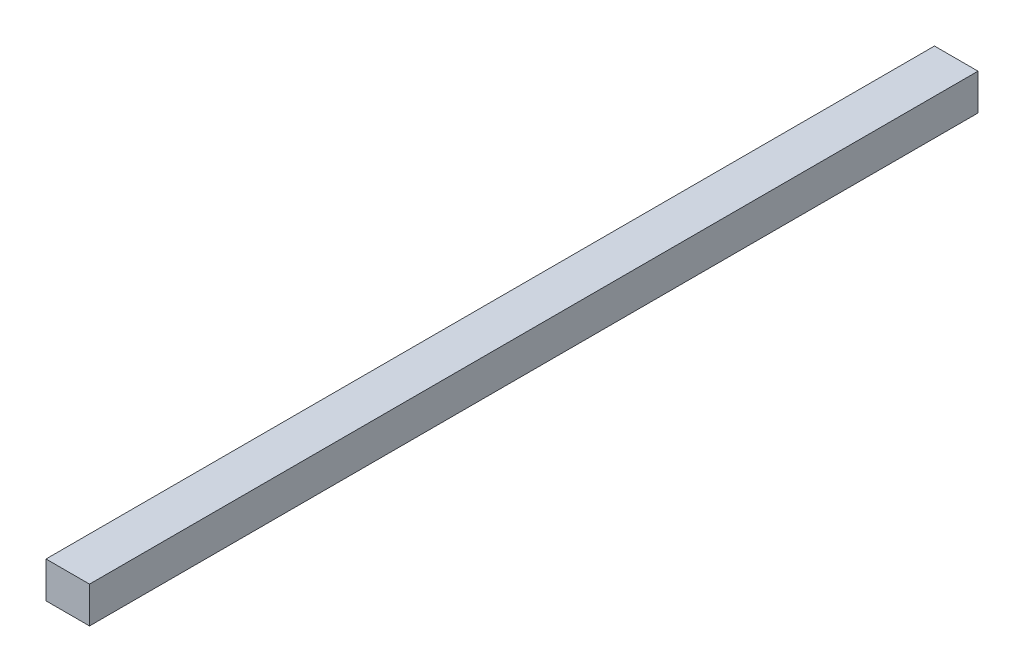
ISO-10303-21;
HEADER;
FILE_DESCRIPTION(('STEP AP214'),'2;1');
FILE_NAME('part.step','',(''),(''),'','','');
FILE_SCHEMA(('AUTOMOTIVE_DESIGN { 1 0 10303 214 1 1 1 1 }'));
ENDSEC;
DATA;
#1=APPLICATION_CONTEXT('core data for automotive mechanical design processes');
#2=APPLICATION_PROTOCOL_DEFINITION('international standard','automotive_design',2000,#1);
#3=PRODUCT_CONTEXT('',#1,'mechanical');
#4=PRODUCT('Part','Part','',(#3));
#5=PRODUCT_RELATED_PRODUCT_CATEGORY('part','',(#4));
#6=PRODUCT_DEFINITION_FORMATION('','',#4);
#7=PRODUCT_DEFINITION_CONTEXT('part definition',#1,'design');
#8=PRODUCT_DEFINITION('design','',#6,#7);
#9=PRODUCT_DEFINITION_SHAPE('','',#8);
#10=(LENGTH_UNIT() NAMED_UNIT(*) SI_UNIT(.MILLI.,.METRE.));
#11=(NAMED_UNIT(*) PLANE_ANGLE_UNIT() SI_UNIT($,.RADIAN.));
#12=(NAMED_UNIT(*) SI_UNIT($,.STERADIAN.) SOLID_ANGLE_UNIT());
#13=UNCERTAINTY_MEASURE_WITH_UNIT(LENGTH_MEASURE(1.E-05),#10,'distance_accuracy_value','');
#14=(GEOMETRIC_REPRESENTATION_CONTEXT(3) GLOBAL_UNCERTAINTY_ASSIGNED_CONTEXT((#13)) GLOBAL_UNIT_ASSIGNED_CONTEXT((#10,
#11,#12)) REPRESENTATION_CONTEXT('',''));
#15=CARTESIAN_POINT('',(0.,0.,0.));
#16=DIRECTION('',(0.,0.,1.));
#17=DIRECTION('',(1.,0.,0.));
#18=AXIS2_PLACEMENT_3D('',#15,#16,#17);
#19=CARTESIAN_POINT('',(0.,0.,122.5));
#20=DIRECTION('',(1.,0.,0.));
#21=DIRECTION('',(0.,0.,-1.));
#22=AXIS2_PLACEMENT_3D('',#19,#20,#21);
#23=PLANE('',#22);
#24=DIRECTION('',(0.,-1.,0.));
#25=VECTOR('',#24,1.);
#26=CARTESIAN_POINT('',(0.,0.,0.));
#27=LINE('',#26,#25);
#28=CARTESIAN_POINT('',(0.,5.,0.));
#29=VERTEX_POINT('',#28);
#30=CARTESIAN_POINT('',(0.,0.,0.));
#31=VERTEX_POINT('',#30);
#32=EDGE_CURVE('E99',#29,#31,#27,.T.);
#33=ORIENTED_EDGE('',*,*,#32,.T.);
#34=DIRECTION('',(0.,0.,-1.));
#35=VECTOR('',#34,1.);
#36=CARTESIAN_POINT('',(0.,0.,122.5));
#37=LINE('',#36,#35);
#38=CARTESIAN_POINT('',(0.,0.,122.5));
#39=VERTEX_POINT('',#38);
#40=EDGE_CURVE('E11',#39,#31,#37,.T.);
#41=ORIENTED_EDGE('',*,*,#40,.F.);
#42=DIRECTION('',(0.,-1.,0.));
#43=VECTOR('',#42,1.);
#44=CARTESIAN_POINT('',(0.,0.,122.5));
#45=LINE('',#44,#43);
#46=CARTESIAN_POINT('',(0.,5.,122.5));
#47=VERTEX_POINT('',#46);
#48=EDGE_CURVE('E87',#47,#39,#45,.T.);
#49=ORIENTED_EDGE('',*,*,#48,.F.);
#50=DIRECTION('',(0.,0.,-1.));
#51=VECTOR('',#50,1.);
#52=CARTESIAN_POINT('',(0.,5.,122.5));
#53=LINE('',#52,#51);
#54=EDGE_CURVE('E95',#47,#29,#53,.T.);
#55=ORIENTED_EDGE('',*,*,#54,.T.);
#56=EDGE_LOOP('',(#33,#41,#49,#55));
#57=FACE_BOUND('',#56,.T.);
#58=ADVANCED_FACE('F36',(#57),#23,.F.);
#59=CARTESIAN_POINT('',(0.,0.,122.5));
#60=DIRECTION('',(0.,1.,0.));
#61=DIRECTION('',(0.,0.,1.));
#62=AXIS2_PLACEMENT_3D('',#59,#60,#61);
#63=PLANE('',#62);
#64=DIRECTION('',(1.,0.,0.));
#65=VECTOR('',#64,1.);
#66=CARTESIAN_POINT('',(0.,0.,0.));
#67=LINE('',#66,#65);
#68=CARTESIAN_POINT('',(6.,0.,0.));
#69=VERTEX_POINT('',#68);
#70=EDGE_CURVE('E91',#31,#69,#67,.T.);
#71=ORIENTED_EDGE('',*,*,#70,.T.);
#72=DIRECTION('',(0.,0.,-1.));
#73=VECTOR('',#72,1.);
#74=CARTESIAN_POINT('',(6.,0.,122.5));
#75=LINE('',#74,#73);
#76=CARTESIAN_POINT('',(6.,0.,122.5));
#77=VERTEX_POINT('',#76);
#78=EDGE_CURVE('E44',#77,#69,#75,.T.);
#79=ORIENTED_EDGE('',*,*,#78,.F.);
#80=DIRECTION('',(1.,0.,0.));
#81=VECTOR('',#80,1.);
#82=CARTESIAN_POINT('',(0.,0.,122.5));
#83=LINE('',#82,#81);
#84=EDGE_CURVE('E82',#39,#77,#83,.T.);
#85=ORIENTED_EDGE('',*,*,#84,.F.);
#86=ORIENTED_EDGE('',*,*,#40,.T.);
#87=EDGE_LOOP('',(#71,#79,#85,#86));
#88=FACE_BOUND('',#87,.T.);
#89=ADVANCED_FACE('F90',(#88),#63,.F.);
#90=CARTESIAN_POINT('',(6.,0.,122.5));
#91=DIRECTION('',(-1.,0.,0.));
#92=DIRECTION('',(0.,0.,1.));
#93=AXIS2_PLACEMENT_3D('',#90,#91,#92);
#94=PLANE('',#93);
#95=DIRECTION('',(0.,1.,0.));
#96=VECTOR('',#95,1.);
#97=CARTESIAN_POINT('',(6.,0.,0.));
#98=LINE('',#97,#96);
#99=CARTESIAN_POINT('',(6.,5.,0.));
#100=VERTEX_POINT('',#99);
#101=EDGE_CURVE('E69',#69,#100,#98,.T.);
#102=ORIENTED_EDGE('',*,*,#101,.T.);
#103=DIRECTION('',(0.,0.,-1.));
#104=VECTOR('',#103,1.);
#105=CARTESIAN_POINT('',(6.,5.,122.5));
#106=LINE('',#105,#104);
#107=CARTESIAN_POINT('',(6.,5.,122.5));
#108=VERTEX_POINT('',#107);
#109=EDGE_CURVE('E92',#108,#100,#106,.T.);
#110=ORIENTED_EDGE('',*,*,#109,.F.);
#111=DIRECTION('',(0.,1.,0.));
#112=VECTOR('',#111,1.);
#113=CARTESIAN_POINT('',(6.,0.,122.5));
#114=LINE('',#113,#112);
#115=EDGE_CURVE('E85',#77,#108,#114,.T.);
#116=ORIENTED_EDGE('',*,*,#115,.F.);
#117=ORIENTED_EDGE('',*,*,#78,.T.);
#118=EDGE_LOOP('',(#102,#110,#116,#117));
#119=FACE_BOUND('',#118,.T.);
#120=ADVANCED_FACE('F93',(#119),#94,.F.);
#121=CARTESIAN_POINT('',(0.,5.,122.5));
#122=DIRECTION('',(0.,-1.,0.));
#123=DIRECTION('',(0.,0.,-1.));
#124=AXIS2_PLACEMENT_3D('',#121,#122,#123);
#125=PLANE('',#124);
#126=DIRECTION('',(-1.,0.,0.));
#127=VECTOR('',#126,1.);
#128=CARTESIAN_POINT('',(0.,5.,0.));
#129=LINE('',#128,#127);
#130=EDGE_CURVE('E75',#100,#29,#129,.T.);
#131=ORIENTED_EDGE('',*,*,#130,.T.);
#132=ORIENTED_EDGE('',*,*,#54,.F.);
#133=DIRECTION('',(-1.,0.,0.));
#134=VECTOR('',#133,1.);
#135=CARTESIAN_POINT('',(0.,5.,122.5));
#136=LINE('',#135,#134);
#137=EDGE_CURVE('E52',#108,#47,#136,.T.);
#138=ORIENTED_EDGE('',*,*,#137,.F.);
#139=ORIENTED_EDGE('',*,*,#109,.T.);
#140=EDGE_LOOP('',(#131,#132,#138,#139));
#141=FACE_BOUND('',#140,.T.);
#142=ADVANCED_FACE('F106',(#141),#125,.F.);
#143=CARTESIAN_POINT('',(0.,0.,122.5));
#144=DIRECTION('',(0.,0.,-1.));
#145=DIRECTION('',(-1.,0.,0.));
#146=AXIS2_PLACEMENT_3D('',#143,#144,#145);
#147=PLANE('',#146);
#148=ORIENTED_EDGE('',*,*,#48,.T.);
#149=ORIENTED_EDGE('',*,*,#84,.T.);
#150=ORIENTED_EDGE('',*,*,#115,.T.);
#151=ORIENTED_EDGE('',*,*,#137,.T.);
#152=EDGE_LOOP('',(#148,#149,#150,#151));
#153=FACE_BOUND('',#152,.T.);
#154=ADVANCED_FACE('F83',(#153),#147,.F.);
#155=CARTESIAN_POINT('',(0.,0.,0.));
#156=DIRECTION('',(0.,0.,-1.));
#157=DIRECTION('',(-1.,0.,0.));
#158=AXIS2_PLACEMENT_3D('',#155,#156,#157);
#159=PLANE('',#158);
#160=ORIENTED_EDGE('',*,*,#32,.F.);
#161=ORIENTED_EDGE('',*,*,#130,.F.);
#162=ORIENTED_EDGE('',*,*,#101,.F.);
#163=ORIENTED_EDGE('',*,*,#70,.F.);
#164=EDGE_LOOP('',(#160,#161,#162,#163));
#165=FACE_BOUND('',#164,.T.);
#166=ADVANCED_FACE('F109',(#165),#159,.T.);
#167=CLOSED_SHELL('',(#58,#89,#120,#142,#154,#166));
#168=MANIFOLD_SOLID_BREP('B2',#167);
#169=ADVANCED_BREP_SHAPE_REPRESENTATION('',(#18,#168),#14);
#170=SHAPE_DEFINITION_REPRESENTATION(#9,#169);
ENDSEC;
END-ISO-10303-21;
